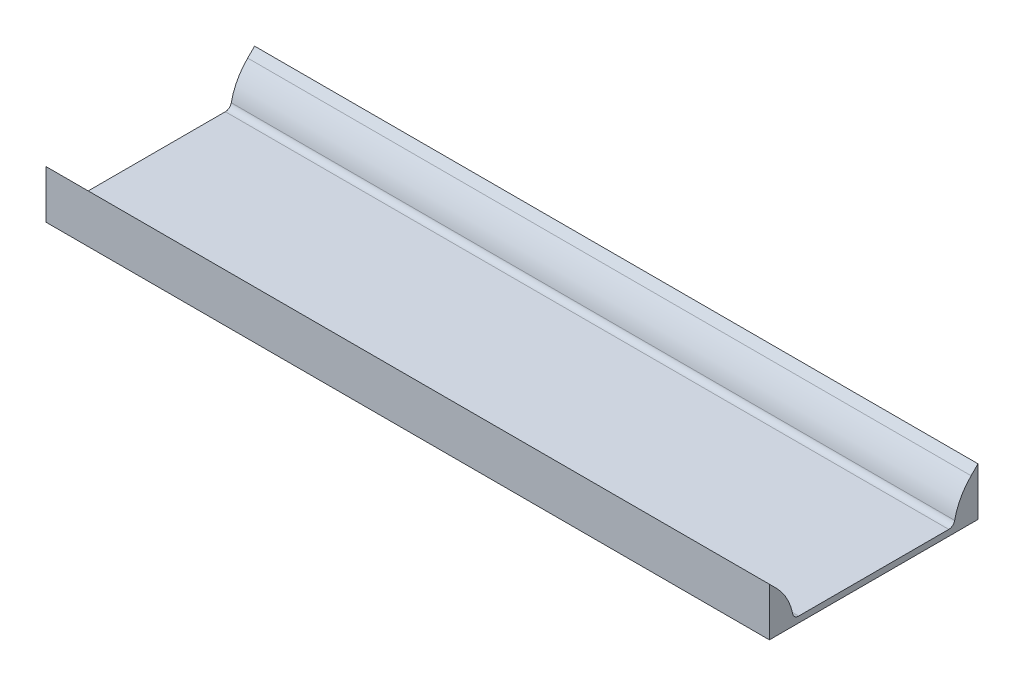
ISO-10303-21;
HEADER;
FILE_DESCRIPTION(('STEP AP214'),'2;1');
FILE_NAME('part.step','',(''),(''),'','','');
FILE_SCHEMA(('AUTOMOTIVE_DESIGN { 1 0 10303 214 1 1 1 1 }'));
ENDSEC;
DATA;
#1=APPLICATION_CONTEXT('core data for automotive mechanical design processes');
#2=APPLICATION_PROTOCOL_DEFINITION('international standard','automotive_design',2000,#1);
#3=PRODUCT_CONTEXT('',#1,'mechanical');
#4=PRODUCT('Part','Part','',(#3));
#5=PRODUCT_RELATED_PRODUCT_CATEGORY('part','',(#4));
#6=PRODUCT_DEFINITION_FORMATION('','',#4);
#7=PRODUCT_DEFINITION_CONTEXT('part definition',#1,'design');
#8=PRODUCT_DEFINITION('design','',#6,#7);
#9=PRODUCT_DEFINITION_SHAPE('','',#8);
#10=(LENGTH_UNIT() NAMED_UNIT(*) SI_UNIT(.MILLI.,.METRE.));
#11=(NAMED_UNIT(*) PLANE_ANGLE_UNIT() SI_UNIT($,.RADIAN.));
#12=(NAMED_UNIT(*) SI_UNIT($,.STERADIAN.) SOLID_ANGLE_UNIT());
#13=UNCERTAINTY_MEASURE_WITH_UNIT(LENGTH_MEASURE(1.E-05),#10,'distance_accuracy_value','');
#14=(GEOMETRIC_REPRESENTATION_CONTEXT(3) GLOBAL_UNCERTAINTY_ASSIGNED_CONTEXT((#13)) GLOBAL_UNIT_ASSIGNED_CONTEXT((#10,
#11,#12)) REPRESENTATION_CONTEXT('',''));
#15=CARTESIAN_POINT('',(0.,0.,0.));
#16=DIRECTION('',(0.,0.,1.));
#17=DIRECTION('',(1.,0.,0.));
#18=AXIS2_PLACEMENT_3D('',#15,#16,#17);
#19=CARTESIAN_POINT('',(76.2,10.16,-21.971));
#20=DIRECTION('',(-1.,0.,0.));
#21=DIRECTION('',(0.,0.,1.));
#22=AXIS2_PLACEMENT_3D('',#19,#20,#21);
#23=PLANE('',#22);
#24=DIRECTION('',(0.,0.,-1.));
#25=VECTOR('',#24,1.);
#26=CARTESIAN_POINT('',(76.2,1.27,0.));
#27=LINE('',#26,#25);
#28=CARTESIAN_POINT('',(76.2,1.27,15.8132118717615));
#29=VERTEX_POINT('',#28);
#30=CARTESIAN_POINT('',(76.2,1.27,-15.8132118717615));
#31=VERTEX_POINT('',#30);
#32=EDGE_CURVE('E178',#29,#31,#27,.T.);
#33=ORIENTED_EDGE('',*,*,#32,.F.);
#34=CARTESIAN_POINT('',(76.2,2.54,15.8132118717615));
#35=DIRECTION('',(-1.,0.,0.));
#36=DIRECTION('',(0.,0.,1.));
#37=AXIS2_PLACEMENT_3D('',#34,#35,#36);
#38=CIRCLE('',#37,1.27);
#39=CARTESIAN_POINT('',(76.2,2.28410749572499,17.0571648557025));
#40=VERTEX_POINT('',#39);
#41=EDGE_CURVE('E174',#29,#40,#38,.T.);
#42=ORIENTED_EDGE('',*,*,#41,.T.);
#43=CARTESIAN_POINT('',(76.2,-0.274817547025183,29.4966946951131));
#44=DIRECTION('',(-1.,0.,0.));
#45=DIRECTION('',(0.,0.,1.));
#46=AXIS2_PLACEMENT_3D('',#43,#44,#45);
#47=CIRCLE('',#46,12.7);
#48=CARTESIAN_POINT('',(76.2,8.705438574044,20.516438574044));
#49=VERTEX_POINT('',#48);
#50=EDGE_CURVE('E155',#40,#49,#47,.F.);
#51=ORIENTED_EDGE('',*,*,#50,.T.);
#52=DIRECTION('',(0.,0.707106781186546,0.707106781186549));
#53=VECTOR('',#52,1.);
#54=CARTESIAN_POINT('',(76.2,5.08000000000003,16.891));
#55=LINE('',#54,#53);
#56=CARTESIAN_POINT('',(76.2,10.16,21.971));
#57=VERTEX_POINT('',#56);
#58=EDGE_CURVE('E125',#49,#57,#55,.T.);
#59=ORIENTED_EDGE('',*,*,#58,.T.);
#60=DIRECTION('',(0.,-1.,0.));
#61=VECTOR('',#60,1.);
#62=CARTESIAN_POINT('',(76.2,10.16,21.971));
#63=LINE('',#62,#61);
#64=CARTESIAN_POINT('',(76.2,0.,21.971));
#65=VERTEX_POINT('',#64);
#66=EDGE_CURVE('E200',#57,#65,#63,.T.);
#67=ORIENTED_EDGE('',*,*,#66,.T.);
#68=DIRECTION('',(0.,0.,-1.));
#69=VECTOR('',#68,1.);
#70=CARTESIAN_POINT('',(76.2,0.,-21.971));
#71=LINE('',#70,#69);
#72=CARTESIAN_POINT('',(76.2,0.,-21.971));
#73=VERTEX_POINT('',#72);
#74=EDGE_CURVE('E141',#65,#73,#71,.T.);
#75=ORIENTED_EDGE('',*,*,#74,.T.);
#76=DIRECTION('',(0.,-1.,0.));
#77=VECTOR('',#76,1.);
#78=CARTESIAN_POINT('',(76.2,10.16,-21.971));
#79=LINE('',#78,#77);
#80=CARTESIAN_POINT('',(76.2,10.16,-21.971));
#81=VERTEX_POINT('',#80);
#82=EDGE_CURVE('E126',#81,#73,#79,.T.);
#83=ORIENTED_EDGE('',*,*,#82,.F.);
#84=DIRECTION('',(0.,0.707106781186551,-0.707106781186544));
#85=VECTOR('',#84,1.);
#86=CARTESIAN_POINT('',(76.2,10.16,-21.971));
#87=LINE('',#86,#85);
#88=CARTESIAN_POINT('',(76.2,8.70543857404386,-20.5164385740439));
#89=VERTEX_POINT('',#88);
#90=EDGE_CURVE('E114',#81,#89,#87,.F.);
#91=ORIENTED_EDGE('',*,*,#90,.T.);
#92=CARTESIAN_POINT('',(76.2,-0.27481754702525,-29.4966946951131));
#93=DIRECTION('',(-1.,0.,0.));
#94=DIRECTION('',(0.,0.,1.));
#95=AXIS2_PLACEMENT_3D('',#92,#93,#94);
#96=CIRCLE('',#95,12.7);
#97=CARTESIAN_POINT('',(76.2,2.28410749572498,-17.0571648557025));
#98=VERTEX_POINT('',#97);
#99=EDGE_CURVE('E153',#89,#98,#96,.F.);
#100=ORIENTED_EDGE('',*,*,#99,.T.);
#101=CARTESIAN_POINT('',(76.2,2.54,-15.8132118717615));
#102=DIRECTION('',(-1.,0.,0.));
#103=DIRECTION('',(0.,0.,1.));
#104=AXIS2_PLACEMENT_3D('',#101,#102,#103);
#105=CIRCLE('',#104,1.27);
#106=EDGE_CURVE('E46',#98,#31,#105,.T.);
#107=ORIENTED_EDGE('',*,*,#106,.T.);
#108=EDGE_LOOP('',(#33,#42,#51,#59,#67,#75,#83,#91,#100,#107));
#109=FACE_BOUND('',#108,.T.);
#110=ADVANCED_FACE('F38',(#109),#23,.F.);
#111=CARTESIAN_POINT('',(-76.2,10.16,-21.971));
#112=DIRECTION('',(0.,0.,1.));
#113=DIRECTION('',(1.,0.,0.));
#114=AXIS2_PLACEMENT_3D('',#111,#112,#113);
#115=PLANE('',#114);
#116=DIRECTION('',(-1.,0.,0.));
#117=VECTOR('',#116,1.);
#118=CARTESIAN_POINT('',(-76.2,0.,-21.971));
#119=LINE('',#118,#117);
#120=CARTESIAN_POINT('',(-76.2,0.,-21.971));
#121=VERTEX_POINT('',#120);
#122=EDGE_CURVE('E194',#73,#121,#119,.T.);
#123=ORIENTED_EDGE('',*,*,#122,.T.);
#124=DIRECTION('',(0.,-1.,0.));
#125=VECTOR('',#124,1.);
#126=CARTESIAN_POINT('',(-76.2,10.16,-21.971));
#127=LINE('',#126,#125);
#128=CARTESIAN_POINT('',(-76.2,10.16,-21.971));
#129=VERTEX_POINT('',#128);
#130=EDGE_CURVE('E134',#129,#121,#127,.T.);
#131=ORIENTED_EDGE('',*,*,#130,.F.);
#132=DIRECTION('',(-1.,0.,0.));
#133=VECTOR('',#132,1.);
#134=CARTESIAN_POINT('',(-76.2,10.16,-21.971));
#135=LINE('',#134,#133);
#136=EDGE_CURVE('E118',#81,#129,#135,.T.);
#137=ORIENTED_EDGE('',*,*,#136,.F.);
#138=ORIENTED_EDGE('',*,*,#82,.T.);
#139=EDGE_LOOP('',(#123,#131,#137,#138));
#140=FACE_BOUND('',#139,.T.);
#141=ADVANCED_FACE('F131',(#140),#115,.F.);
#142=CARTESIAN_POINT('',(-76.2,10.16,-21.971));
#143=DIRECTION('',(1.,0.,0.));
#144=DIRECTION('',(0.,0.,-1.));
#145=AXIS2_PLACEMENT_3D('',#142,#143,#144);
#146=PLANE('',#145);
#147=DIRECTION('',(0.,-0.707106781186546,-0.707106781186549));
#148=VECTOR('',#147,1.);
#149=CARTESIAN_POINT('',(-76.2,5.08000000000003,16.891));
#150=LINE('',#149,#148);
#151=CARTESIAN_POINT('',(-76.2,10.16,21.971));
#152=VERTEX_POINT('',#151);
#153=CARTESIAN_POINT('',(-76.2,8.705438574044,20.516438574044));
#154=VERTEX_POINT('',#153);
#155=EDGE_CURVE('E150',#152,#154,#150,.T.);
#156=ORIENTED_EDGE('',*,*,#155,.T.);
#157=CARTESIAN_POINT('',(-76.2,-0.274817547025183,29.4966946951131));
#158=DIRECTION('',(1.,0.,0.));
#159=DIRECTION('',(0.,0.,-1.));
#160=AXIS2_PLACEMENT_3D('',#157,#158,#159);
#161=CIRCLE('',#160,12.7);
#162=CARTESIAN_POINT('',(-76.2,2.28410749572499,17.0571648557025));
#163=VERTEX_POINT('',#162);
#164=EDGE_CURVE('E161',#154,#163,#161,.F.);
#165=ORIENTED_EDGE('',*,*,#164,.T.);
#166=CARTESIAN_POINT('',(-76.2,2.54,15.8132118717615));
#167=DIRECTION('',(1.,0.,0.));
#168=DIRECTION('',(0.,0.,-1.));
#169=AXIS2_PLACEMENT_3D('',#166,#167,#168);
#170=CIRCLE('',#169,1.27);
#171=CARTESIAN_POINT('',(-76.2,1.27,15.8132118717615));
#172=VERTEX_POINT('',#171);
#173=EDGE_CURVE('E176',#163,#172,#170,.T.);
#174=ORIENTED_EDGE('',*,*,#173,.T.);
#175=DIRECTION('',(0.,0.,1.));
#176=VECTOR('',#175,1.);
#177=CARTESIAN_POINT('',(-76.2,1.27,0.));
#178=LINE('',#177,#176);
#179=CARTESIAN_POINT('',(-76.2,1.27,-15.8132118717615));
#180=VERTEX_POINT('',#179);
#181=EDGE_CURVE('E183',#180,#172,#178,.T.);
#182=ORIENTED_EDGE('',*,*,#181,.F.);
#183=CARTESIAN_POINT('',(-76.2,2.54,-15.8132118717615));
#184=DIRECTION('',(1.,0.,0.));
#185=DIRECTION('',(0.,0.,-1.));
#186=AXIS2_PLACEMENT_3D('',#183,#184,#185);
#187=CIRCLE('',#186,1.27);
#188=CARTESIAN_POINT('',(-76.2,2.28410749572498,-17.0571648557025));
#189=VERTEX_POINT('',#188);
#190=EDGE_CURVE('E11',#180,#189,#187,.T.);
#191=ORIENTED_EDGE('',*,*,#190,.T.);
#192=CARTESIAN_POINT('',(-76.2,-0.27481754702525,-29.4966946951131));
#193=DIRECTION('',(1.,0.,0.));
#194=DIRECTION('',(0.,0.,-1.));
#195=AXIS2_PLACEMENT_3D('',#192,#193,#194);
#196=CIRCLE('',#195,12.7);
#197=CARTESIAN_POINT('',(-76.2,8.70543857404386,-20.5164385740439));
#198=VERTEX_POINT('',#197);
#199=EDGE_CURVE('E159',#189,#198,#196,.F.);
#200=ORIENTED_EDGE('',*,*,#199,.T.);
#201=DIRECTION('',(0.,-0.707106781186551,0.707106781186544));
#202=VECTOR('',#201,1.);
#203=CARTESIAN_POINT('',(-76.2,10.16,-21.971));
#204=LINE('',#203,#202);
#205=EDGE_CURVE('E148',#198,#129,#204,.F.);
#206=ORIENTED_EDGE('',*,*,#205,.T.);
#207=ORIENTED_EDGE('',*,*,#130,.T.);
#208=DIRECTION('',(0.,0.,1.));
#209=VECTOR('',#208,1.);
#210=CARTESIAN_POINT('',(-76.2,0.,-21.971));
#211=LINE('',#210,#209);
#212=CARTESIAN_POINT('',(-76.2,0.,21.971));
#213=VERTEX_POINT('',#212);
#214=EDGE_CURVE('E189',#121,#213,#211,.T.);
#215=ORIENTED_EDGE('',*,*,#214,.T.);
#216=DIRECTION('',(0.,-1.,0.));
#217=VECTOR('',#216,1.);
#218=CARTESIAN_POINT('',(-76.2,10.16,21.971));
#219=LINE('',#218,#217);
#220=EDGE_CURVE('E143',#152,#213,#219,.T.);
#221=ORIENTED_EDGE('',*,*,#220,.F.);
#222=EDGE_LOOP('',(#156,#165,#174,#182,#191,#200,#206,#207,#215,#221));
#223=FACE_BOUND('',#222,.T.);
#224=ADVANCED_FACE('F187',(#223),#146,.F.);
#225=CARTESIAN_POINT('',(-76.2,10.16,21.971));
#226=DIRECTION('',(0.,0.,-1.));
#227=DIRECTION('',(-1.,0.,0.));
#228=AXIS2_PLACEMENT_3D('',#225,#226,#227);
#229=PLANE('',#228);
#230=DIRECTION('',(1.,0.,0.));
#231=VECTOR('',#230,1.);
#232=CARTESIAN_POINT('',(-76.2,0.,21.971));
#233=LINE('',#232,#231);
#234=EDGE_CURVE('E136',#213,#65,#233,.T.);
#235=ORIENTED_EDGE('',*,*,#234,.T.);
#236=ORIENTED_EDGE('',*,*,#66,.F.);
#237=DIRECTION('',(1.,0.,0.));
#238=VECTOR('',#237,1.);
#239=CARTESIAN_POINT('',(-76.2,10.16,21.971));
#240=LINE('',#239,#238);
#241=EDGE_CURVE('E135',#152,#57,#240,.T.);
#242=ORIENTED_EDGE('',*,*,#241,.F.);
#243=ORIENTED_EDGE('',*,*,#220,.T.);
#244=EDGE_LOOP('',(#235,#236,#242,#243));
#245=FACE_BOUND('',#244,.T.);
#246=ADVANCED_FACE('F203',(#245),#229,.F.);
#247=CARTESIAN_POINT('',(0.,0.,0.));
#248=DIRECTION('',(0.,1.,0.));
#249=DIRECTION('',(0.,0.,1.));
#250=AXIS2_PLACEMENT_3D('',#247,#248,#249);
#251=PLANE('',#250);
#252=ORIENTED_EDGE('',*,*,#74,.F.);
#253=ORIENTED_EDGE('',*,*,#234,.F.);
#254=ORIENTED_EDGE('',*,*,#214,.F.);
#255=ORIENTED_EDGE('',*,*,#122,.F.);
#256=EDGE_LOOP('',(#252,#253,#254,#255));
#257=FACE_BOUND('',#256,.T.);
#258=ADVANCED_FACE('F193',(#257),#251,.F.);
#259=CARTESIAN_POINT('',(0.,1.27,0.));
#260=DIRECTION('',(0.,1.,0.));
#261=DIRECTION('',(0.,0.,1.));
#262=AXIS2_PLACEMENT_3D('',#259,#260,#261);
#263=PLANE('',#262);
#264=ORIENTED_EDGE('',*,*,#181,.T.);
#265=DIRECTION('',(1.,0.,0.));
#266=VECTOR('',#265,1.);
#267=CARTESIAN_POINT('',(76.2,1.27,15.8132118717615));
#268=LINE('',#267,#266);
#269=EDGE_CURVE('E167',#172,#29,#268,.T.);
#270=ORIENTED_EDGE('',*,*,#269,.T.);
#271=ORIENTED_EDGE('',*,*,#32,.T.);
#272=DIRECTION('',(1.,0.,0.));
#273=VECTOR('',#272,1.);
#274=CARTESIAN_POINT('',(-76.2,1.27,-15.8132118717615));
#275=LINE('',#274,#273);
#276=EDGE_CURVE('E165',#31,#180,#275,.F.);
#277=ORIENTED_EDGE('',*,*,#276,.T.);
#278=EDGE_LOOP('',(#264,#270,#271,#277));
#279=FACE_BOUND('',#278,.T.);
#280=ADVANCED_FACE('F181',(#279),#263,.T.);
#281=CARTESIAN_POINT('',(0.,5.08000000000003,16.891));
#282=DIRECTION('',(0.,0.707106781186549,-0.707106781186546));
#283=DIRECTION('',(-1.,0.,0.));
#284=AXIS2_PLACEMENT_3D('',#281,#282,#283);
#285=PLANE('',#284);
#286=ORIENTED_EDGE('',*,*,#58,.F.);
#287=DIRECTION('',(1.,0.,0.));
#288=VECTOR('',#287,1.);
#289=CARTESIAN_POINT('',(-76.2,8.705438574044,20.516438574044));
#290=LINE('',#289,#288);
#291=EDGE_CURVE('E157',#49,#154,#290,.F.);
#292=ORIENTED_EDGE('',*,*,#291,.T.);
#293=ORIENTED_EDGE('',*,*,#155,.F.);
#294=ORIENTED_EDGE('',*,*,#241,.T.);
#295=EDGE_LOOP('',(#286,#292,#293,#294));
#296=FACE_BOUND('',#295,.T.);
#297=ADVANCED_FACE('F220',(#296),#285,.T.);
#298=CARTESIAN_POINT('',(0.,10.16,-21.971));
#299=DIRECTION('',(0.,-0.707106781186544,-0.707106781186551));
#300=DIRECTION('',(1.,0.,0.));
#301=AXIS2_PLACEMENT_3D('',#298,#299,#300);
#302=PLANE('',#301);
#303=ORIENTED_EDGE('',*,*,#205,.F.);
#304=DIRECTION('',(-1.,0.,0.));
#305=VECTOR('',#304,1.);
#306=CARTESIAN_POINT('',(76.2,8.70543857404386,-20.5164385740439));
#307=LINE('',#306,#305);
#308=EDGE_CURVE('E120',#198,#89,#307,.F.);
#309=ORIENTED_EDGE('',*,*,#308,.T.);
#310=ORIENTED_EDGE('',*,*,#90,.F.);
#311=ORIENTED_EDGE('',*,*,#136,.T.);
#312=EDGE_LOOP('',(#303,#309,#310,#311));
#313=FACE_BOUND('',#312,.T.);
#314=ADVANCED_FACE('F117',(#313),#302,.F.);
#315=CARTESIAN_POINT('',(0.,-0.274817547025183,29.4966946951131));
#316=DIRECTION('',(-1.,0.,0.));
#317=DIRECTION('',(0.,0.,1.));
#318=AXIS2_PLACEMENT_3D('',#315,#316,#317);
#319=CYLINDRICAL_SURFACE('',#318,12.7);
#320=ORIENTED_EDGE('',*,*,#50,.F.);
#321=DIRECTION('',(-1.,0.,0.));
#322=VECTOR('',#321,1.);
#323=CARTESIAN_POINT('',(0.,2.28410749572499,17.0571648557025));
#324=LINE('',#323,#322);
#325=EDGE_CURVE('E170',#40,#163,#324,.T.);
#326=ORIENTED_EDGE('',*,*,#325,.T.);
#327=ORIENTED_EDGE('',*,*,#164,.F.);
#328=ORIENTED_EDGE('',*,*,#291,.F.);
#329=EDGE_LOOP('',(#320,#326,#327,#328));
#330=FACE_BOUND('',#329,.T.);
#331=ADVANCED_FACE('F213',(#330),#319,.T.);
#332=CARTESIAN_POINT('',(0.,-0.27481754702525,-29.4966946951131));
#333=DIRECTION('',(-1.,0.,0.));
#334=DIRECTION('',(0.,0.,1.));
#335=AXIS2_PLACEMENT_3D('',#332,#333,#334);
#336=CYLINDRICAL_SURFACE('',#335,12.7);
#337=ORIENTED_EDGE('',*,*,#199,.F.);
#338=DIRECTION('',(-1.,0.,0.));
#339=VECTOR('',#338,1.);
#340=CARTESIAN_POINT('',(0.,2.28410749572498,-17.0571648557025));
#341=LINE('',#340,#339);
#342=EDGE_CURVE('E172',#189,#98,#341,.F.);
#343=ORIENTED_EDGE('',*,*,#342,.T.);
#344=ORIENTED_EDGE('',*,*,#99,.F.);
#345=ORIENTED_EDGE('',*,*,#308,.F.);
#346=EDGE_LOOP('',(#337,#343,#344,#345));
#347=FACE_BOUND('',#346,.T.);
#348=ADVANCED_FACE('F186',(#347),#336,.T.);
#349=CARTESIAN_POINT('',(0.,2.54,15.8132118717615));
#350=DIRECTION('',(-1.,0.,0.));
#351=DIRECTION('',(0.,0.,1.));
#352=AXIS2_PLACEMENT_3D('',#349,#350,#351);
#353=CYLINDRICAL_SURFACE('',#352,1.27);
#354=ORIENTED_EDGE('',*,*,#173,.F.);
#355=ORIENTED_EDGE('',*,*,#325,.F.);
#356=ORIENTED_EDGE('',*,*,#41,.F.);
#357=ORIENTED_EDGE('',*,*,#269,.F.);
#358=EDGE_LOOP('',(#354,#355,#356,#357));
#359=FACE_BOUND('',#358,.T.);
#360=ADVANCED_FACE('F216',(#359),#353,.F.);
#361=CARTESIAN_POINT('',(0.,2.54,-15.8132118717615));
#362=DIRECTION('',(-1.,0.,0.));
#363=DIRECTION('',(0.,0.,1.));
#364=AXIS2_PLACEMENT_3D('',#361,#362,#363);
#365=CYLINDRICAL_SURFACE('',#364,1.27);
#366=ORIENTED_EDGE('',*,*,#190,.F.);
#367=ORIENTED_EDGE('',*,*,#276,.F.);
#368=ORIENTED_EDGE('',*,*,#106,.F.);
#369=ORIENTED_EDGE('',*,*,#342,.F.);
#370=EDGE_LOOP('',(#366,#367,#368,#369));
#371=FACE_BOUND('',#370,.T.);
#372=ADVANCED_FACE('F40',(#371),#365,.F.);
#373=CLOSED_SHELL('',(#110,#141,#224,#246,#258,#280,#297,#314,#331,#348,#360,#372));
#374=MANIFOLD_SOLID_BREP('B2',#373);
#375=ADVANCED_BREP_SHAPE_REPRESENTATION('',(#18,#374),#14);
#376=SHAPE_DEFINITION_REPRESENTATION(#9,#375);
ENDSEC;
END-ISO-10303-21;
